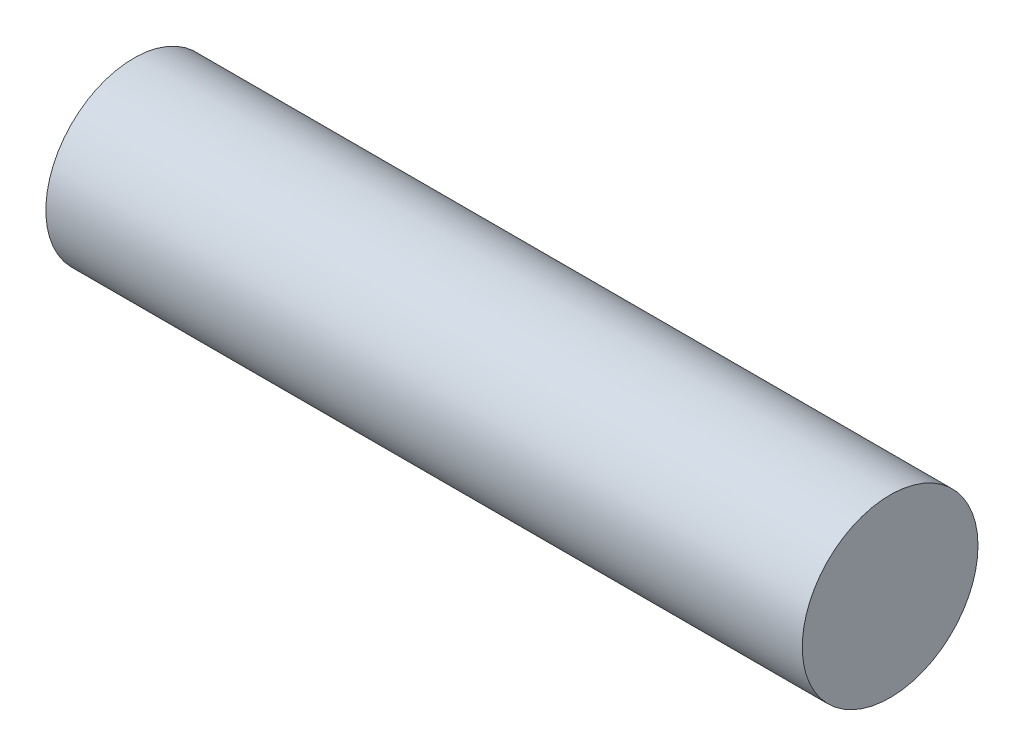
ISO-10303-21;
HEADER;
FILE_DESCRIPTION(('STEP AP214'),'2;1');
FILE_NAME('part.step','',(''),(''),'','','');
FILE_SCHEMA(('AUTOMOTIVE_DESIGN { 1 0 10303 214 1 1 1 1 }'));
ENDSEC;
DATA;
#1=APPLICATION_CONTEXT('core data for automotive mechanical design processes');
#2=APPLICATION_PROTOCOL_DEFINITION('international standard','automotive_design',2000,#1);
#3=PRODUCT_CONTEXT('',#1,'mechanical');
#4=PRODUCT('Part','Part','',(#3));
#5=PRODUCT_RELATED_PRODUCT_CATEGORY('part','',(#4));
#6=PRODUCT_DEFINITION_FORMATION('','',#4);
#7=PRODUCT_DEFINITION_CONTEXT('part definition',#1,'design');
#8=PRODUCT_DEFINITION('design','',#6,#7);
#9=PRODUCT_DEFINITION_SHAPE('','',#8);
#10=(LENGTH_UNIT() NAMED_UNIT(*) SI_UNIT(.MILLI.,.METRE.));
#11=(NAMED_UNIT(*) PLANE_ANGLE_UNIT() SI_UNIT($,.RADIAN.));
#12=(NAMED_UNIT(*) SI_UNIT($,.STERADIAN.) SOLID_ANGLE_UNIT());
#13=UNCERTAINTY_MEASURE_WITH_UNIT(LENGTH_MEASURE(1.E-05),#10,'distance_accuracy_value','');
#14=(GEOMETRIC_REPRESENTATION_CONTEXT(3) GLOBAL_UNCERTAINTY_ASSIGNED_CONTEXT((#13)) GLOBAL_UNIT_ASSIGNED_CONTEXT((#10,
#11,#12)) REPRESENTATION_CONTEXT('',''));
#15=CARTESIAN_POINT('',(0.,0.,0.));
#16=DIRECTION('',(0.,0.,1.));
#17=DIRECTION('',(1.,0.,0.));
#18=AXIS2_PLACEMENT_3D('',#15,#16,#17);
#19=CARTESIAN_POINT('',(41.,0.,0.));
#20=DIRECTION('',(-1.,0.,0.));
#21=DIRECTION('',(0.,0.,1.));
#22=AXIS2_PLACEMENT_3D('',#19,#20,#21);
#23=CYLINDRICAL_SURFACE('',#22,4.7625);
#24=CARTESIAN_POINT('',(41.,0.,0.));
#25=DIRECTION('',(1.,0.,0.));
#26=DIRECTION('',(0.,0.,-1.));
#27=AXIS2_PLACEMENT_3D('',#24,#25,#26);
#28=CIRCLE('',#27,4.7625);
#29=CARTESIAN_POINT('',(41.,0.,-4.7625));
#30=VERTEX_POINT('',#29);
#31=EDGE_CURVE('E10',#30,#30,#28,.T.);
#32=ORIENTED_EDGE('',*,*,#31,.F.);
#33=EDGE_LOOP('',(#32));
#34=FACE_BOUND('',#33,.T.);
#35=CARTESIAN_POINT('',(0.,0.,0.));
#36=DIRECTION('',(1.,0.,0.));
#37=DIRECTION('',(0.,0.,-1.));
#38=AXIS2_PLACEMENT_3D('',#35,#36,#37);
#39=CIRCLE('',#38,4.7625);
#40=CARTESIAN_POINT('',(0.,0.,-4.7625));
#41=VERTEX_POINT('',#40);
#42=EDGE_CURVE('E34',#41,#41,#39,.T.);
#43=ORIENTED_EDGE('',*,*,#42,.T.);
#44=EDGE_LOOP('',(#43));
#45=FACE_BOUND('',#44,.T.);
#46=ADVANCED_FACE('F31',(#34,#45),#23,.T.);
#47=CARTESIAN_POINT('',(41.,0.,0.));
#48=DIRECTION('',(1.,0.,0.));
#49=DIRECTION('',(0.,0.,-1.));
#50=AXIS2_PLACEMENT_3D('',#47,#48,#49);
#51=PLANE('',#50);
#52=ORIENTED_EDGE('',*,*,#31,.T.);
#53=EDGE_LOOP('',(#52));
#54=FACE_BOUND('',#53,.T.);
#55=ADVANCED_FACE('F46',(#54),#51,.T.);
#56=CARTESIAN_POINT('',(0.,0.,0.));
#57=DIRECTION('',(1.,0.,0.));
#58=DIRECTION('',(0.,0.,-1.));
#59=AXIS2_PLACEMENT_3D('',#56,#57,#58);
#60=PLANE('',#59);
#61=ORIENTED_EDGE('',*,*,#42,.F.);
#62=EDGE_LOOP('',(#61));
#63=FACE_BOUND('',#62,.T.);
#64=ADVANCED_FACE('F44',(#63),#60,.F.);
#65=CLOSED_SHELL('',(#46,#55,#64));
#66=MANIFOLD_SOLID_BREP('B2',#65);
#67=ADVANCED_BREP_SHAPE_REPRESENTATION('',(#18,#66),#14);
#68=SHAPE_DEFINITION_REPRESENTATION(#9,#67);
ENDSEC;
END-ISO-10303-21;
